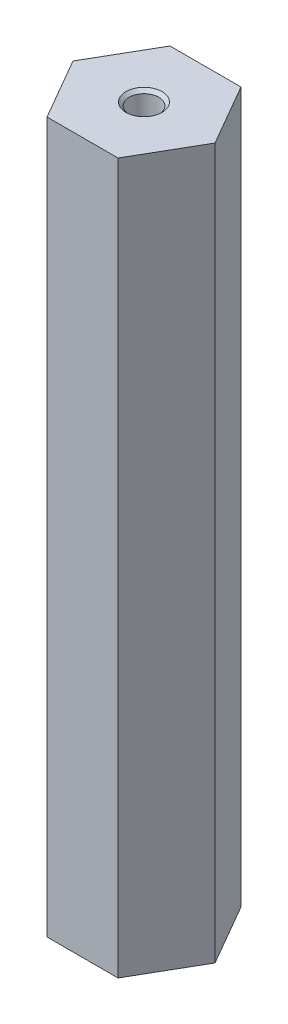
ISO-10303-21;
HEADER;
FILE_DESCRIPTION(('STEP AP214'),'2;1');
FILE_NAME('part.step','',(''),(''),'','','');
FILE_SCHEMA(('AUTOMOTIVE_DESIGN { 1 0 10303 214 1 1 1 1 }'));
ENDSEC;
DATA;
#1=APPLICATION_CONTEXT('core data for automotive mechanical design processes');
#2=APPLICATION_PROTOCOL_DEFINITION('international standard','automotive_design',2000,#1);
#3=PRODUCT_CONTEXT('',#1,'mechanical');
#4=PRODUCT('Part','Part','',(#3));
#5=PRODUCT_RELATED_PRODUCT_CATEGORY('part','',(#4));
#6=PRODUCT_DEFINITION_FORMATION('','',#4);
#7=PRODUCT_DEFINITION_CONTEXT('part definition',#1,'design');
#8=PRODUCT_DEFINITION('design','',#6,#7);
#9=PRODUCT_DEFINITION_SHAPE('','',#8);
#10=(LENGTH_UNIT() NAMED_UNIT(*) SI_UNIT(.MILLI.,.METRE.));
#11=(NAMED_UNIT(*) PLANE_ANGLE_UNIT() SI_UNIT($,.RADIAN.));
#12=(NAMED_UNIT(*) SI_UNIT($,.STERADIAN.) SOLID_ANGLE_UNIT());
#13=UNCERTAINTY_MEASURE_WITH_UNIT(LENGTH_MEASURE(1.E-05),#10,'distance_accuracy_value','');
#14=(GEOMETRIC_REPRESENTATION_CONTEXT(3) GLOBAL_UNCERTAINTY_ASSIGNED_CONTEXT((#13)) GLOBAL_UNIT_ASSIGNED_CONTEXT((#10,
#11,#12)) REPRESENTATION_CONTEXT('',''));
#15=CARTESIAN_POINT('',(0.,0.,0.));
#16=DIRECTION('',(0.,0.,1.));
#17=DIRECTION('',(1.,0.,0.));
#18=AXIS2_PLACEMENT_3D('',#15,#16,#17);
#19=CARTESIAN_POINT('',(3.,60.,5.19615242270663));
#20=DIRECTION('',(-0.866025403784439,0.,-0.5));
#21=DIRECTION('',(-0.5,0.,0.866025403784439));
#22=AXIS2_PLACEMENT_3D('',#19,#20,#21);
#23=PLANE('',#22);
#24=DIRECTION('',(0.5,0.,-0.866025403784439));
#25=VECTOR('',#24,1.);
#26=CARTESIAN_POINT('',(3.,0.,5.19615242270663));
#27=LINE('',#26,#25);
#28=CARTESIAN_POINT('',(3.,0.,5.19615242270663));
#29=VERTEX_POINT('',#28);
#30=CARTESIAN_POINT('',(6.,0.,0.));
#31=VERTEX_POINT('',#30);
#32=EDGE_CURVE('E131',#29,#31,#27,.T.);
#33=ORIENTED_EDGE('',*,*,#32,.T.);
#34=DIRECTION('',(0.,-1.,0.));
#35=VECTOR('',#34,1.);
#36=CARTESIAN_POINT('',(6.,60.,0.));
#37=LINE('',#36,#35);
#38=CARTESIAN_POINT('',(6.,60.,0.));
#39=VERTEX_POINT('',#38);
#40=EDGE_CURVE('E11',#39,#31,#37,.T.);
#41=ORIENTED_EDGE('',*,*,#40,.F.);
#42=DIRECTION('',(0.5,0.,-0.866025403784439));
#43=VECTOR('',#42,1.);
#44=CARTESIAN_POINT('',(3.,60.,5.19615242270663));
#45=LINE('',#44,#43);
#46=CARTESIAN_POINT('',(3.,60.,5.19615242270663));
#47=VERTEX_POINT('',#46);
#48=EDGE_CURVE('E142',#47,#39,#45,.T.);
#49=ORIENTED_EDGE('',*,*,#48,.F.);
#50=DIRECTION('',(0.,-1.,0.));
#51=VECTOR('',#50,1.);
#52=CARTESIAN_POINT('',(3.,60.,5.19615242270663));
#53=LINE('',#52,#51);
#54=EDGE_CURVE('E127',#47,#29,#53,.T.);
#55=ORIENTED_EDGE('',*,*,#54,.T.);
#56=EDGE_LOOP('',(#33,#41,#49,#55));
#57=FACE_BOUND('',#56,.T.);
#58=ADVANCED_FACE('F47',(#57),#23,.F.);
#59=CARTESIAN_POINT('',(6.,60.,0.));
#60=DIRECTION('',(-0.866025403784439,0.,0.5));
#61=DIRECTION('',(0.5,0.,0.866025403784439));
#62=AXIS2_PLACEMENT_3D('',#59,#60,#61);
#63=PLANE('',#62);
#64=DIRECTION('',(-0.5,0.,-0.866025403784439));
#65=VECTOR('',#64,1.);
#66=CARTESIAN_POINT('',(6.,0.,0.));
#67=LINE('',#66,#65);
#68=CARTESIAN_POINT('',(3.,0.,-5.19615242270663));
#69=VERTEX_POINT('',#68);
#70=EDGE_CURVE('E134',#31,#69,#67,.T.);
#71=ORIENTED_EDGE('',*,*,#70,.T.);
#72=DIRECTION('',(0.,-1.,0.));
#73=VECTOR('',#72,1.);
#74=CARTESIAN_POINT('',(3.,60.,-5.19615242270663));
#75=LINE('',#74,#73);
#76=CARTESIAN_POINT('',(3.,60.,-5.19615242270663));
#77=VERTEX_POINT('',#76);
#78=EDGE_CURVE('E55',#77,#69,#75,.T.);
#79=ORIENTED_EDGE('',*,*,#78,.F.);
#80=DIRECTION('',(-0.5,0.,-0.866025403784439));
#81=VECTOR('',#80,1.);
#82=CARTESIAN_POINT('',(6.,60.,0.));
#83=LINE('',#82,#81);
#84=EDGE_CURVE('E100',#39,#77,#83,.T.);
#85=ORIENTED_EDGE('',*,*,#84,.F.);
#86=ORIENTED_EDGE('',*,*,#40,.T.);
#87=EDGE_LOOP('',(#71,#79,#85,#86));
#88=FACE_BOUND('',#87,.T.);
#89=ADVANCED_FACE('F167',(#88),#63,.F.);
#90=CARTESIAN_POINT('',(3.,60.,-5.19615242270663));
#91=DIRECTION('',(0.,0.,1.));
#92=DIRECTION('',(1.,0.,0.));
#93=AXIS2_PLACEMENT_3D('',#90,#91,#92);
#94=PLANE('',#93);
#95=DIRECTION('',(-1.,0.,0.));
#96=VECTOR('',#95,1.);
#97=CARTESIAN_POINT('',(3.,0.,-5.19615242270663));
#98=LINE('',#97,#96);
#99=CARTESIAN_POINT('',(-3.,0.,-5.19615242270663));
#100=VERTEX_POINT('',#99);
#101=EDGE_CURVE('E137',#69,#100,#98,.T.);
#102=ORIENTED_EDGE('',*,*,#101,.T.);
#103=DIRECTION('',(0.,-1.,0.));
#104=VECTOR('',#103,1.);
#105=CARTESIAN_POINT('',(-3.,60.,-5.19615242270663));
#106=LINE('',#105,#104);
#107=CARTESIAN_POINT('',(-3.,60.,-5.19615242270663));
#108=VERTEX_POINT('',#107);
#109=EDGE_CURVE('E122',#108,#100,#106,.T.);
#110=ORIENTED_EDGE('',*,*,#109,.F.);
#111=DIRECTION('',(-1.,0.,0.));
#112=VECTOR('',#111,1.);
#113=CARTESIAN_POINT('',(3.,60.,-5.19615242270663));
#114=LINE('',#113,#112);
#115=EDGE_CURVE('E113',#77,#108,#114,.T.);
#116=ORIENTED_EDGE('',*,*,#115,.F.);
#117=ORIENTED_EDGE('',*,*,#78,.T.);
#118=EDGE_LOOP('',(#102,#110,#116,#117));
#119=FACE_BOUND('',#118,.T.);
#120=ADVANCED_FACE('F148',(#119),#94,.F.);
#121=CARTESIAN_POINT('',(-3.,60.,-5.19615242270663));
#122=DIRECTION('',(0.866025403784439,0.,0.5));
#123=DIRECTION('',(0.5,0.,-0.866025403784439));
#124=AXIS2_PLACEMENT_3D('',#121,#122,#123);
#125=PLANE('',#124);
#126=DIRECTION('',(-0.5,0.,0.866025403784439));
#127=VECTOR('',#126,1.);
#128=CARTESIAN_POINT('',(-3.,0.,-5.19615242270663));
#129=LINE('',#128,#127);
#130=CARTESIAN_POINT('',(-6.,0.,0.));
#131=VERTEX_POINT('',#130);
#132=EDGE_CURVE('E121',#100,#131,#129,.T.);
#133=ORIENTED_EDGE('',*,*,#132,.T.);
#134=DIRECTION('',(0.,-1.,0.));
#135=VECTOR('',#134,1.);
#136=CARTESIAN_POINT('',(-6.,60.,0.));
#137=LINE('',#136,#135);
#138=CARTESIAN_POINT('',(-6.,60.,0.));
#139=VERTEX_POINT('',#138);
#140=EDGE_CURVE('E118',#139,#131,#137,.T.);
#141=ORIENTED_EDGE('',*,*,#140,.F.);
#142=DIRECTION('',(-0.5,0.,0.866025403784439));
#143=VECTOR('',#142,1.);
#144=CARTESIAN_POINT('',(-3.,60.,-5.19615242270663));
#145=LINE('',#144,#143);
#146=EDGE_CURVE('E107',#108,#139,#145,.T.);
#147=ORIENTED_EDGE('',*,*,#146,.F.);
#148=ORIENTED_EDGE('',*,*,#109,.T.);
#149=EDGE_LOOP('',(#133,#141,#147,#148));
#150=FACE_BOUND('',#149,.T.);
#151=ADVANCED_FACE('F119',(#150),#125,.F.);
#152=CARTESIAN_POINT('',(-6.,60.,0.));
#153=DIRECTION('',(0.866025403784439,0.,-0.5));
#154=DIRECTION('',(-0.5,0.,-0.866025403784439));
#155=AXIS2_PLACEMENT_3D('',#152,#153,#154);
#156=PLANE('',#155);
#157=DIRECTION('',(0.5,0.,0.866025403784439));
#158=VECTOR('',#157,1.);
#159=CARTESIAN_POINT('',(-6.,0.,0.));
#160=LINE('',#159,#158);
#161=CARTESIAN_POINT('',(-3.,0.,5.19615242270663));
#162=VERTEX_POINT('',#161);
#163=EDGE_CURVE('E86',#131,#162,#160,.T.);
#164=ORIENTED_EDGE('',*,*,#163,.T.);
#165=DIRECTION('',(0.,-1.,0.));
#166=VECTOR('',#165,1.);
#167=CARTESIAN_POINT('',(-3.,60.,5.19615242270663));
#168=LINE('',#167,#166);
#169=CARTESIAN_POINT('',(-3.,60.,5.19615242270663));
#170=VERTEX_POINT('',#169);
#171=EDGE_CURVE('E123',#170,#162,#168,.T.);
#172=ORIENTED_EDGE('',*,*,#171,.F.);
#173=DIRECTION('',(0.5,0.,0.866025403784439));
#174=VECTOR('',#173,1.);
#175=CARTESIAN_POINT('',(-6.,60.,0.));
#176=LINE('',#175,#174);
#177=EDGE_CURVE('E111',#139,#170,#176,.T.);
#178=ORIENTED_EDGE('',*,*,#177,.F.);
#179=ORIENTED_EDGE('',*,*,#140,.T.);
#180=EDGE_LOOP('',(#164,#172,#178,#179));
#181=FACE_BOUND('',#180,.T.);
#182=ADVANCED_FACE('F125',(#181),#156,.F.);
#183=CARTESIAN_POINT('',(-3.,60.,5.19615242270663));
#184=DIRECTION('',(0.,0.,-1.));
#185=DIRECTION('',(-1.,0.,0.));
#186=AXIS2_PLACEMENT_3D('',#183,#184,#185);
#187=PLANE('',#186);
#188=DIRECTION('',(1.,0.,0.));
#189=VECTOR('',#188,1.);
#190=CARTESIAN_POINT('',(-3.,0.,5.19615242270663));
#191=LINE('',#190,#189);
#192=EDGE_CURVE('E92',#162,#29,#191,.T.);
#193=ORIENTED_EDGE('',*,*,#192,.T.);
#194=ORIENTED_EDGE('',*,*,#54,.F.);
#195=DIRECTION('',(1.,0.,0.));
#196=VECTOR('',#195,1.);
#197=CARTESIAN_POINT('',(-3.,60.,5.19615242270663));
#198=LINE('',#197,#196);
#199=EDGE_CURVE('E63',#170,#47,#198,.T.);
#200=ORIENTED_EDGE('',*,*,#199,.F.);
#201=ORIENTED_EDGE('',*,*,#171,.T.);
#202=EDGE_LOOP('',(#193,#194,#200,#201));
#203=FACE_BOUND('',#202,.T.);
#204=ADVANCED_FACE('F155',(#203),#187,.F.);
#205=CARTESIAN_POINT('',(0.,60.,0.));
#206=DIRECTION('',(0.,1.,0.));
#207=DIRECTION('',(0.,0.,1.));
#208=AXIS2_PLACEMENT_3D('',#205,#206,#207);
#209=PLANE('',#208);
#210=CARTESIAN_POINT('',(0.,60.,0.));
#211=DIRECTION('',(0.,1.,0.));
#212=DIRECTION('',(0.,0.,1.));
#213=AXIS2_PLACEMENT_3D('',#210,#211,#212);
#214=CIRCLE('',#213,1.525);
#215=CARTESIAN_POINT('',(0.,60.,1.525));
#216=VERTEX_POINT('',#215);
#217=EDGE_CURVE('E236',#216,#216,#214,.T.);
#218=ORIENTED_EDGE('',*,*,#217,.F.);
#219=EDGE_LOOP('',(#218));
#220=FACE_BOUND('',#219,.T.);
#221=ORIENTED_EDGE('',*,*,#48,.T.);
#222=ORIENTED_EDGE('',*,*,#84,.T.);
#223=ORIENTED_EDGE('',*,*,#115,.T.);
#224=ORIENTED_EDGE('',*,*,#146,.T.);
#225=ORIENTED_EDGE('',*,*,#177,.T.);
#226=ORIENTED_EDGE('',*,*,#199,.T.);
#227=EDGE_LOOP('',(#221,#222,#223,#224,#225,#226));
#228=FACE_BOUND('',#227,.T.);
#229=ADVANCED_FACE('F109',(#220,#228),#209,.T.);
#230=CARTESIAN_POINT('',(0.,0.,0.));
#231=DIRECTION('',(0.,1.,0.));
#232=DIRECTION('',(0.,0.,1.));
#233=AXIS2_PLACEMENT_3D('',#230,#231,#232);
#234=PLANE('',#233);
#235=CARTESIAN_POINT('',(0.,0.,0.));
#236=DIRECTION('',(0.,1.,0.));
#237=DIRECTION('',(0.,0.,1.));
#238=AXIS2_PLACEMENT_3D('',#235,#236,#237);
#239=CIRCLE('',#238,1.24999999999998);
#240=CARTESIAN_POINT('',(0.,0.,1.24999999999998));
#241=VERTEX_POINT('',#240);
#242=EDGE_CURVE('E135',#241,#241,#239,.T.);
#243=ORIENTED_EDGE('',*,*,#242,.T.);
#244=EDGE_LOOP('',(#243));
#245=FACE_BOUND('',#244,.T.);
#246=ORIENTED_EDGE('',*,*,#32,.F.);
#247=ORIENTED_EDGE('',*,*,#192,.F.);
#248=ORIENTED_EDGE('',*,*,#163,.F.);
#249=ORIENTED_EDGE('',*,*,#132,.F.);
#250=ORIENTED_EDGE('',*,*,#101,.F.);
#251=ORIENTED_EDGE('',*,*,#70,.F.);
#252=EDGE_LOOP('',(#246,#247,#248,#249,#250,#251));
#253=FACE_BOUND('',#252,.T.);
#254=ADVANCED_FACE('F151',(#245,#253),#234,.F.);
#255=CARTESIAN_POINT('',(0.,60.,0.));
#256=DIRECTION('',(0.,1.,0.));
#257=DIRECTION('',(0.,0.,1.));
#258=AXIS2_PLACEMENT_3D('',#255,#256,#257);
#259=CYLINDRICAL_SURFACE('',#258,1.24999999999999);
#260=ORIENTED_EDGE('',*,*,#242,.F.);
#261=EDGE_LOOP('',(#260));
#262=FACE_BOUND('',#261,.T.);
#263=CARTESIAN_POINT('',(0.,59.725,0.));
#264=DIRECTION('',(0.,1.,0.));
#265=DIRECTION('',(0.,0.,1.));
#266=AXIS2_PLACEMENT_3D('',#263,#264,#265);
#267=CIRCLE('',#266,1.25);
#268=CARTESIAN_POINT('',(0.,59.725,1.25));
#269=VERTEX_POINT('',#268);
#270=EDGE_CURVE('E233',#269,#269,#267,.T.);
#271=ORIENTED_EDGE('',*,*,#270,.T.);
#272=EDGE_LOOP('',(#271));
#273=FACE_BOUND('',#272,.T.);
#274=ADVANCED_FACE('F206',(#262,#273),#259,.F.);
#275=CARTESIAN_POINT('',(0.,60.,0.));
#276=DIRECTION('',(0.,1.,0.));
#277=DIRECTION('',(0.,0.,1.));
#278=AXIS2_PLACEMENT_3D('',#275,#276,#277);
#279=CONICAL_SURFACE('',#278,1.525,0.785398163397455);
#280=ORIENTED_EDGE('',*,*,#270,.F.);
#281=EDGE_LOOP('',(#280));
#282=FACE_BOUND('',#281,.T.);
#283=ORIENTED_EDGE('',*,*,#217,.T.);
#284=EDGE_LOOP('',(#283));
#285=FACE_BOUND('',#284,.T.);
#286=ADVANCED_FACE('F216',(#282,#285),#279,.F.);
#287=CLOSED_SHELL('',(#58,#89,#120,#151,#182,#204,#229,#254,#274,#286));
#288=MANIFOLD_SOLID_BREP('B2',#287);
#289=ADVANCED_BREP_SHAPE_REPRESENTATION('',(#18,#288),#14);
#290=SHAPE_DEFINITION_REPRESENTATION(#9,#289);
ENDSEC;
END-ISO-10303-21;
